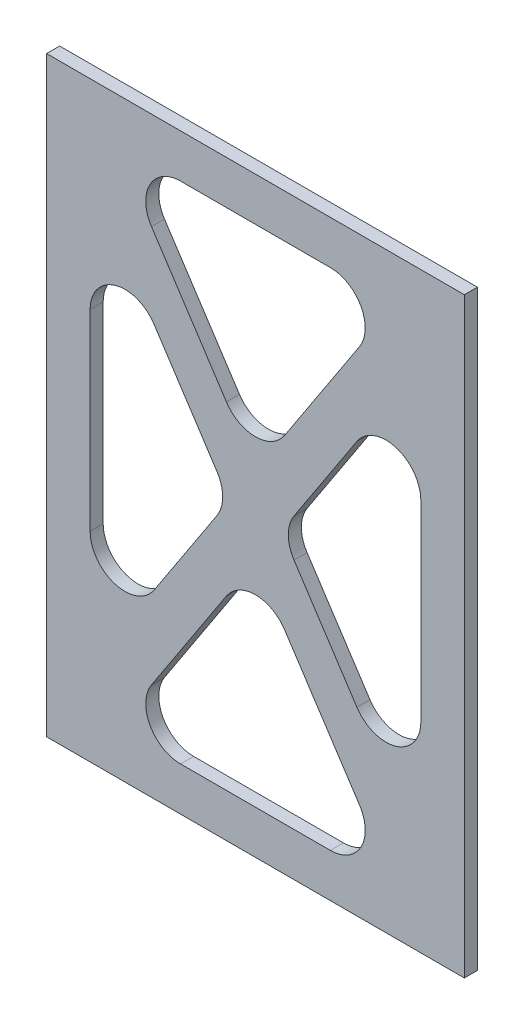
ISO-10303-21;
HEADER;
FILE_DESCRIPTION(('STEP AP214'),'2;1');
FILE_NAME('part.step','',(''),(''),'','','');
FILE_SCHEMA(('AUTOMOTIVE_DESIGN { 1 0 10303 214 1 1 1 1 }'));
ENDSEC;
DATA;
#1=APPLICATION_CONTEXT('core data for automotive mechanical design processes');
#2=APPLICATION_PROTOCOL_DEFINITION('international standard','automotive_design',2000,#1);
#3=PRODUCT_CONTEXT('',#1,'mechanical');
#4=PRODUCT('Part','Part','',(#3));
#5=PRODUCT_RELATED_PRODUCT_CATEGORY('part','',(#4));
#6=PRODUCT_DEFINITION_FORMATION('','',#4);
#7=PRODUCT_DEFINITION_CONTEXT('part definition',#1,'design');
#8=PRODUCT_DEFINITION('design','',#6,#7);
#9=PRODUCT_DEFINITION_SHAPE('','',#8);
#10=(LENGTH_UNIT() NAMED_UNIT(*) SI_UNIT(.MILLI.,.METRE.));
#11=(NAMED_UNIT(*) PLANE_ANGLE_UNIT() SI_UNIT($,.RADIAN.));
#12=(NAMED_UNIT(*) SI_UNIT($,.STERADIAN.) SOLID_ANGLE_UNIT());
#13=UNCERTAINTY_MEASURE_WITH_UNIT(LENGTH_MEASURE(1.E-05),#10,'distance_accuracy_value','');
#14=(GEOMETRIC_REPRESENTATION_CONTEXT(3) GLOBAL_UNCERTAINTY_ASSIGNED_CONTEXT((#13)) GLOBAL_UNIT_ASSIGNED_CONTEXT((#10,
#11,#12)) REPRESENTATION_CONTEXT('',''));
#15=CARTESIAN_POINT('',(0.,0.,0.));
#16=DIRECTION('',(0.,0.,1.));
#17=DIRECTION('',(1.,0.,0.));
#18=AXIS2_PLACEMENT_3D('',#15,#16,#17);
#19=CARTESIAN_POINT('',(0.,0.,3.));
#20=DIRECTION('',(0.,0.,-1.));
#21=DIRECTION('',(-1.,0.,0.));
#22=AXIS2_PLACEMENT_3D('',#19,#20,#21);
#23=PLANE('',#22);
#24=DIRECTION('',(-0.548026257310873,-0.836461129579753,0.));
#25=VECTOR('',#24,1.);
#26=CARTESIAN_POINT('',(4.18230564789876,-2.74013128655436,3.));
#27=LINE('',#26,#25);
#28=CARTESIAN_POINT('',(23.3083109633619,26.4521926159947,3.));
#29=VERTEX_POINT('',#28);
#30=CARTESIAN_POINT('',(8.84997756361549,4.38421005848697,3.));
#31=VERTEX_POINT('',#30);
#32=EDGE_CURVE('E616',#29,#31,#27,.T.);
#33=ORIENTED_EDGE('',*,*,#32,.F.);
#34=CARTESIAN_POINT('',(30.,22.0679825575077,3.));
#35=DIRECTION('',(0.,0.,-1.));
#36=DIRECTION('',(-1.,0.,0.));
#37=AXIS2_PLACEMENT_3D('',#34,#35,#36);
#38=CIRCLE('',#37,8.);
#39=CARTESIAN_POINT('',(38.,22.0679825575077,3.));
#40=VERTEX_POINT('',#39);
#41=EDGE_CURVE('E457',#29,#40,#38,.T.);
#42=ORIENTED_EDGE('',*,*,#41,.T.);
#43=DIRECTION('',(0.,1.,0.));
#44=VECTOR('',#43,1.);
#45=CARTESIAN_POINT('',(38.,0.,3.));
#46=LINE('',#45,#44);
#47=CARTESIAN_POINT('',(38.,-22.0679825575078,3.));
#48=VERTEX_POINT('',#47);
#49=EDGE_CURVE('E613',#48,#40,#46,.T.);
#50=ORIENTED_EDGE('',*,*,#49,.F.);
#51=CARTESIAN_POINT('',(30.,-22.0679825575078,3.));
#52=DIRECTION('',(0.,0.,-1.));
#53=DIRECTION('',(-1.,0.,0.));
#54=AXIS2_PLACEMENT_3D('',#51,#52,#53);
#55=CIRCLE('',#54,8.);
#56=CARTESIAN_POINT('',(23.308310963362,-26.4521926159947,3.));
#57=VERTEX_POINT('',#56);
#58=EDGE_CURVE('E421',#48,#57,#55,.T.);
#59=ORIENTED_EDGE('',*,*,#58,.T.);
#60=DIRECTION('',(0.548026257310873,-0.836461129579753,0.));
#61=VECTOR('',#60,1.);
#62=CARTESIAN_POINT('',(4.18230564789875,2.74013128655435,3.));
#63=LINE('',#62,#61);
#64=CARTESIAN_POINT('',(8.8499775636155,-4.38421005848699,3.));
#65=VERTEX_POINT('',#64);
#66=EDGE_CURVE('E619',#65,#57,#63,.T.);
#67=ORIENTED_EDGE('',*,*,#66,.F.);
#68=CARTESIAN_POINT('',(15.5416666002535,0.,3.));
#69=DIRECTION('',(0.,0.,-1.));
#70=DIRECTION('',(-1.,0.,0.));
#71=AXIS2_PLACEMENT_3D('',#68,#69,#70);
#72=CIRCLE('',#71,8.);
#73=EDGE_CURVE('E445',#65,#31,#72,.T.);
#74=ORIENTED_EDGE('',*,*,#73,.T.);
#75=EDGE_LOOP('',(#33,#42,#50,#59,#67,#74));
#76=FACE_BOUND('',#75,.T.);
#77=DIRECTION('',(0.548026257310873,-0.836461129579753,0.));
#78=VECTOR('',#77,1.);
#79=CARTESIAN_POINT('',(4.18230564789875,2.74013128655435,3.));
#80=LINE('',#79,#78);
#81=CARTESIAN_POINT('',(-23.9086431260397,45.615789941513,3.));
#82=VERTEX_POINT('',#81);
#83=CARTESIAN_POINT('',(-6.69168903663804,19.3372810682158,3.));
#84=VERTEX_POINT('',#83);
#85=EDGE_CURVE('E556',#82,#84,#80,.T.);
#86=ORIENTED_EDGE('',*,*,#85,.F.);
#87=CARTESIAN_POINT('',(-17.2169540894017,50.,3.));
#88=DIRECTION('',(0.,0.,-1.));
#89=DIRECTION('',(-1.,0.,0.));
#90=AXIS2_PLACEMENT_3D('',#87,#88,#89);
#91=CIRCLE('',#90,8.);
#92=CARTESIAN_POINT('',(-17.2169540894017,58.,3.));
#93=VERTEX_POINT('',#92);
#94=EDGE_CURVE('E119',#82,#93,#91,.T.);
#95=ORIENTED_EDGE('',*,*,#94,.T.);
#96=DIRECTION('',(-1.,0.,0.));
#97=VECTOR('',#96,1.);
#98=CARTESIAN_POINT('',(0.,58.,3.));
#99=LINE('',#98,#97);
#100=CARTESIAN_POINT('',(17.2169540894016,58.,3.));
#101=VERTEX_POINT('',#100);
#102=EDGE_CURVE('E562',#101,#93,#99,.T.);
#103=ORIENTED_EDGE('',*,*,#102,.F.);
#104=CARTESIAN_POINT('',(17.2169540894016,50.,3.));
#105=DIRECTION('',(0.,0.,-1.));
#106=DIRECTION('',(-1.,0.,0.));
#107=AXIS2_PLACEMENT_3D('',#104,#105,#106);
#108=CIRCLE('',#107,8.);
#109=CARTESIAN_POINT('',(23.9086431260396,45.615789941513,3.));
#110=VERTEX_POINT('',#109);
#111=EDGE_CURVE('E133',#101,#110,#108,.T.);
#112=ORIENTED_EDGE('',*,*,#111,.T.);
#113=DIRECTION('',(-0.548026257310873,-0.836461129579753,0.));
#114=VECTOR('',#113,1.);
#115=CARTESIAN_POINT('',(-4.18230564789877,2.74013128655437,3.));
#116=LINE('',#115,#114);
#117=CARTESIAN_POINT('',(6.69168903663801,19.3372810682158,3.));
#118=VERTEX_POINT('',#117);
#119=EDGE_CURVE('E554',#110,#118,#116,.T.);
#120=ORIENTED_EDGE('',*,*,#119,.T.);
#121=CARTESIAN_POINT('',(0.,23.7214911267028,3.));
#122=DIRECTION('',(0.,0.,-1.));
#123=DIRECTION('',(-1.,0.,0.));
#124=AXIS2_PLACEMENT_3D('',#121,#122,#123);
#125=CIRCLE('',#124,8.);
#126=EDGE_CURVE('E453',#118,#84,#125,.T.);
#127=ORIENTED_EDGE('',*,*,#126,.T.);
#128=EDGE_LOOP('',(#86,#95,#103,#112,#120,#127));
#129=FACE_BOUND('',#128,.T.);
#130=DIRECTION('',(0.,-1.,0.));
#131=VECTOR('',#130,1.);
#132=CARTESIAN_POINT('',(-38.,0.,3.));
#133=LINE('',#132,#131);
#134=CARTESIAN_POINT('',(-38.,22.0679825575078,3.));
#135=VERTEX_POINT('',#134);
#136=CARTESIAN_POINT('',(-38.,-22.0679825575078,3.));
#137=VERTEX_POINT('',#136);
#138=EDGE_CURVE('E559',#135,#137,#133,.T.);
#139=ORIENTED_EDGE('',*,*,#138,.F.);
#140=CARTESIAN_POINT('',(-30.,22.0679825575078,3.));
#141=DIRECTION('',(0.,0.,-1.));
#142=DIRECTION('',(-1.,0.,0.));
#143=AXIS2_PLACEMENT_3D('',#140,#141,#142);
#144=CIRCLE('',#143,8.);
#145=CARTESIAN_POINT('',(-23.308310963362,26.4521926159947,3.));
#146=VERTEX_POINT('',#145);
#147=EDGE_CURVE('E441',#135,#146,#144,.T.);
#148=ORIENTED_EDGE('',*,*,#147,.T.);
#149=DIRECTION('',(0.548026257310873,-0.836461129579753,0.));
#150=VECTOR('',#149,1.);
#151=CARTESIAN_POINT('',(-4.18230564789878,-2.74013128655437,3.));
#152=LINE('',#151,#150);
#153=CARTESIAN_POINT('',(-8.84997756361553,4.38421005848697,3.));
#154=VERTEX_POINT('',#153);
#155=EDGE_CURVE('E555',#146,#154,#152,.T.);
#156=ORIENTED_EDGE('',*,*,#155,.T.);
#157=CARTESIAN_POINT('',(-15.5416666002536,0.,3.));
#158=DIRECTION('',(0.,0.,-1.));
#159=DIRECTION('',(-1.,0.,0.));
#160=AXIS2_PLACEMENT_3D('',#157,#158,#159);
#161=CIRCLE('',#160,8.);
#162=CARTESIAN_POINT('',(-8.84997756361553,-4.38421005848699,3.));
#163=VERTEX_POINT('',#162);
#164=EDGE_CURVE('E449',#154,#163,#161,.T.);
#165=ORIENTED_EDGE('',*,*,#164,.T.);
#166=DIRECTION('',(-0.548026257310873,-0.836461129579753,0.));
#167=VECTOR('',#166,1.);
#168=CARTESIAN_POINT('',(-4.18230564789877,2.74013128655437,3.));
#169=LINE('',#168,#167);
#170=CARTESIAN_POINT('',(-23.308310963362,-26.4521926159948,3.));
#171=VERTEX_POINT('',#170);
#172=EDGE_CURVE('E568',#163,#171,#169,.T.);
#173=ORIENTED_EDGE('',*,*,#172,.T.);
#174=CARTESIAN_POINT('',(-30.,-22.0679825575078,3.));
#175=DIRECTION('',(0.,0.,-1.));
#176=DIRECTION('',(-1.,0.,0.));
#177=AXIS2_PLACEMENT_3D('',#174,#175,#176);
#178=CIRCLE('',#177,8.);
#179=EDGE_CURVE('E437',#171,#137,#178,.T.);
#180=ORIENTED_EDGE('',*,*,#179,.T.);
#181=EDGE_LOOP('',(#139,#148,#156,#165,#173,#180));
#182=FACE_BOUND('',#181,.T.);
#183=DIRECTION('',(0.,1.,0.));
#184=VECTOR('',#183,1.);
#185=CARTESIAN_POINT('',(48.,-68.,3.));
#186=LINE('',#185,#184);
#187=CARTESIAN_POINT('',(48.,-68.,3.));
#188=VERTEX_POINT('',#187);
#189=CARTESIAN_POINT('',(48.,68.,3.));
#190=VERTEX_POINT('',#189);
#191=EDGE_CURVE('E307',#188,#190,#186,.T.);
#192=ORIENTED_EDGE('',*,*,#191,.T.);
#193=DIRECTION('',(-1.,0.,0.));
#194=VECTOR('',#193,1.);
#195=CARTESIAN_POINT('',(-48.,68.,3.));
#196=LINE('',#195,#194);
#197=CARTESIAN_POINT('',(-48.,68.,3.));
#198=VERTEX_POINT('',#197);
#199=EDGE_CURVE('E296',#190,#198,#196,.T.);
#200=ORIENTED_EDGE('',*,*,#199,.T.);
#201=DIRECTION('',(0.,-1.,0.));
#202=VECTOR('',#201,1.);
#203=CARTESIAN_POINT('',(-48.,-68.,3.));
#204=LINE('',#203,#202);
#205=CARTESIAN_POINT('',(-48.,-68.,3.));
#206=VERTEX_POINT('',#205);
#207=EDGE_CURVE('E306',#198,#206,#204,.T.);
#208=ORIENTED_EDGE('',*,*,#207,.T.);
#209=DIRECTION('',(1.,0.,0.));
#210=VECTOR('',#209,1.);
#211=CARTESIAN_POINT('',(-48.,-68.,3.));
#212=LINE('',#211,#210);
#213=EDGE_CURVE('E312',#206,#188,#212,.T.);
#214=ORIENTED_EDGE('',*,*,#213,.T.);
#215=EDGE_LOOP('',(#192,#200,#208,#214));
#216=FACE_BOUND('',#215,.T.);
#217=DIRECTION('',(-0.548026257310873,-0.836461129579753,0.));
#218=VECTOR('',#217,1.);
#219=CARTESIAN_POINT('',(4.18230564789876,-2.74013128655436,3.));
#220=LINE('',#219,#218);
#221=CARTESIAN_POINT('',(-6.69168903663804,-19.3372810682158,3.));
#222=VERTEX_POINT('',#221);
#223=CARTESIAN_POINT('',(-23.9086431260397,-45.615789941513,3.));
#224=VERTEX_POINT('',#223);
#225=EDGE_CURVE('E606',#222,#224,#220,.T.);
#226=ORIENTED_EDGE('',*,*,#225,.F.);
#227=CARTESIAN_POINT('',(0.,-23.7214911267028,3.));
#228=DIRECTION('',(0.,0.,-1.));
#229=DIRECTION('',(-1.,0.,0.));
#230=AXIS2_PLACEMENT_3D('',#227,#228,#229);
#231=CIRCLE('',#230,8.);
#232=CARTESIAN_POINT('',(6.69168903663801,-19.3372810682158,3.));
#233=VERTEX_POINT('',#232);
#234=EDGE_CURVE('E429',#222,#233,#231,.T.);
#235=ORIENTED_EDGE('',*,*,#234,.T.);
#236=DIRECTION('',(0.548026257310873,-0.836461129579753,0.));
#237=VECTOR('',#236,1.);
#238=CARTESIAN_POINT('',(-4.18230564789878,-2.74013128655437,3.));
#239=LINE('',#238,#237);
#240=CARTESIAN_POINT('',(23.9086431260397,-45.615789941513,3.));
#241=VERTEX_POINT('',#240);
#242=EDGE_CURVE('E601',#233,#241,#239,.T.);
#243=ORIENTED_EDGE('',*,*,#242,.T.);
#244=CARTESIAN_POINT('',(17.2169540894016,-50.,3.));
#245=DIRECTION('',(0.,0.,-1.));
#246=DIRECTION('',(-1.,0.,0.));
#247=AXIS2_PLACEMENT_3D('',#244,#245,#246);
#248=CIRCLE('',#247,8.);
#249=CARTESIAN_POINT('',(17.2169540894016,-58.,3.));
#250=VERTEX_POINT('',#249);
#251=EDGE_CURVE('E425',#241,#250,#248,.T.);
#252=ORIENTED_EDGE('',*,*,#251,.T.);
#253=DIRECTION('',(1.,0.,0.));
#254=VECTOR('',#253,1.);
#255=CARTESIAN_POINT('',(0.,-58.,3.));
#256=LINE('',#255,#254);
#257=CARTESIAN_POINT('',(-17.2169540894017,-58.,3.));
#258=VERTEX_POINT('',#257);
#259=EDGE_CURVE('E609',#258,#250,#256,.T.);
#260=ORIENTED_EDGE('',*,*,#259,.F.);
#261=CARTESIAN_POINT('',(-17.2169540894017,-50.,3.));
#262=DIRECTION('',(0.,0.,-1.));
#263=DIRECTION('',(-1.,0.,0.));
#264=AXIS2_PLACEMENT_3D('',#261,#262,#263);
#265=CIRCLE('',#264,8.);
#266=EDGE_CURVE('E433',#258,#224,#265,.T.);
#267=ORIENTED_EDGE('',*,*,#266,.T.);
#268=EDGE_LOOP('',(#226,#235,#243,#252,#260,#267));
#269=FACE_BOUND('',#268,.T.);
#270=ADVANCED_FACE('F111',(#76,#129,#182,#216,#269),#23,.F.);
#271=CARTESIAN_POINT('',(0.,0.,0.));
#272=DIRECTION('',(0.,0.,-1.));
#273=DIRECTION('',(-1.,0.,0.));
#274=AXIS2_PLACEMENT_3D('',#271,#272,#273);
#275=PLANE('',#274);
#276=DIRECTION('',(0.,-1.,0.));
#277=VECTOR('',#276,1.);
#278=CARTESIAN_POINT('',(38.,0.,0.));
#279=LINE('',#278,#277);
#280=CARTESIAN_POINT('',(38.,22.0679825575077,0.));
#281=VERTEX_POINT('',#280);
#282=CARTESIAN_POINT('',(38.,-22.0679825575078,0.));
#283=VERTEX_POINT('',#282);
#284=EDGE_CURVE('E359',#281,#283,#279,.T.);
#285=ORIENTED_EDGE('',*,*,#284,.F.);
#286=CARTESIAN_POINT('',(30.,22.0679825575077,0.));
#287=DIRECTION('',(0.,0.,-1.));
#288=DIRECTION('',(-1.,0.,0.));
#289=AXIS2_PLACEMENT_3D('',#286,#287,#288);
#290=CIRCLE('',#289,8.);
#291=CARTESIAN_POINT('',(23.308310963362,26.4521926159947,0.));
#292=VERTEX_POINT('',#291);
#293=EDGE_CURVE('E459',#281,#292,#290,.F.);
#294=ORIENTED_EDGE('',*,*,#293,.T.);
#295=DIRECTION('',(0.548026257310873,0.836461129579753,0.));
#296=VECTOR('',#295,1.);
#297=CARTESIAN_POINT('',(4.18230564789876,-2.74013128655436,0.));
#298=LINE('',#297,#296);
#299=CARTESIAN_POINT('',(8.84997756361549,4.38421005848697,0.));
#300=VERTEX_POINT('',#299);
#301=EDGE_CURVE('E353',#300,#292,#298,.T.);
#302=ORIENTED_EDGE('',*,*,#301,.F.);
#303=CARTESIAN_POINT('',(15.5416666002535,0.,0.));
#304=DIRECTION('',(0.,0.,-1.));
#305=DIRECTION('',(-1.,0.,0.));
#306=AXIS2_PLACEMENT_3D('',#303,#304,#305);
#307=CIRCLE('',#306,8.);
#308=CARTESIAN_POINT('',(8.8499775636155,-4.384210058487,0.));
#309=VERTEX_POINT('',#308);
#310=EDGE_CURVE('E447',#300,#309,#307,.F.);
#311=ORIENTED_EDGE('',*,*,#310,.T.);
#312=DIRECTION('',(-0.548026257310873,0.836461129579753,0.));
#313=VECTOR('',#312,1.);
#314=CARTESIAN_POINT('',(4.18230564789875,2.74013128655435,0.));
#315=LINE('',#314,#313);
#316=CARTESIAN_POINT('',(23.308310963362,-26.4521926159948,0.));
#317=VERTEX_POINT('',#316);
#318=EDGE_CURVE('E356',#317,#309,#315,.T.);
#319=ORIENTED_EDGE('',*,*,#318,.F.);
#320=CARTESIAN_POINT('',(30.,-22.0679825575078,0.));
#321=DIRECTION('',(0.,0.,-1.));
#322=DIRECTION('',(-1.,0.,0.));
#323=AXIS2_PLACEMENT_3D('',#320,#321,#322);
#324=CIRCLE('',#323,8.);
#325=EDGE_CURVE('E423',#317,#283,#324,.F.);
#326=ORIENTED_EDGE('',*,*,#325,.T.);
#327=EDGE_LOOP('',(#285,#294,#302,#311,#319,#326));
#328=FACE_BOUND('',#327,.T.);
#329=DIRECTION('',(1.,0.,0.));
#330=VECTOR('',#329,1.);
#331=CARTESIAN_POINT('',(0.,58.,0.));
#332=LINE('',#331,#330);
#333=CARTESIAN_POINT('',(-17.2169540894017,58.,0.));
#334=VERTEX_POINT('',#333);
#335=CARTESIAN_POINT('',(17.2169540894016,58.,0.));
#336=VERTEX_POINT('',#335);
#337=EDGE_CURVE('E350',#334,#336,#332,.T.);
#338=ORIENTED_EDGE('',*,*,#337,.F.);
#339=CARTESIAN_POINT('',(-17.2169540894017,50.,0.));
#340=DIRECTION('',(0.,0.,-1.));
#341=DIRECTION('',(-1.,0.,0.));
#342=AXIS2_PLACEMENT_3D('',#339,#340,#341);
#343=CIRCLE('',#342,8.);
#344=CARTESIAN_POINT('',(-23.9086431260397,45.615789941513,0.));
#345=VERTEX_POINT('',#344);
#346=EDGE_CURVE('E12',#334,#345,#343,.F.);
#347=ORIENTED_EDGE('',*,*,#346,.T.);
#348=DIRECTION('',(-0.548026257310873,0.836461129579753,0.));
#349=VECTOR('',#348,1.);
#350=CARTESIAN_POINT('',(4.18230564789875,2.74013128655435,0.));
#351=LINE('',#350,#349);
#352=CARTESIAN_POINT('',(-6.69168903663805,19.3372810682158,0.));
#353=VERTEX_POINT('',#352);
#354=EDGE_CURVE('E344',#353,#345,#351,.T.);
#355=ORIENTED_EDGE('',*,*,#354,.F.);
#356=CARTESIAN_POINT('',(0.,23.7214911267028,0.));
#357=DIRECTION('',(0.,0.,-1.));
#358=DIRECTION('',(-1.,0.,0.));
#359=AXIS2_PLACEMENT_3D('',#356,#357,#358);
#360=CIRCLE('',#359,8.);
#361=CARTESIAN_POINT('',(6.69168903663801,19.3372810682158,0.));
#362=VERTEX_POINT('',#361);
#363=EDGE_CURVE('E455',#353,#362,#360,.F.);
#364=ORIENTED_EDGE('',*,*,#363,.T.);
#365=DIRECTION('',(0.548026257310873,0.836461129579753,0.));
#366=VECTOR('',#365,1.);
#367=CARTESIAN_POINT('',(-4.18230564789877,2.74013128655437,0.));
#368=LINE('',#367,#366);
#369=CARTESIAN_POINT('',(23.9086431260396,45.615789941513,0.));
#370=VERTEX_POINT('',#369);
#371=EDGE_CURVE('E347',#362,#370,#368,.T.);
#372=ORIENTED_EDGE('',*,*,#371,.T.);
#373=CARTESIAN_POINT('',(17.2169540894016,50.,0.));
#374=DIRECTION('',(0.,0.,-1.));
#375=DIRECTION('',(-1.,0.,0.));
#376=AXIS2_PLACEMENT_3D('',#373,#374,#375);
#377=CIRCLE('',#376,8.);
#378=EDGE_CURVE('E462',#370,#336,#377,.F.);
#379=ORIENTED_EDGE('',*,*,#378,.T.);
#380=EDGE_LOOP('',(#338,#347,#355,#364,#372,#379));
#381=FACE_BOUND('',#380,.T.);
#382=DIRECTION('',(0.,1.,0.));
#383=VECTOR('',#382,1.);
#384=CARTESIAN_POINT('',(48.,-68.,0.));
#385=LINE('',#384,#383);
#386=CARTESIAN_POINT('',(48.,-68.,0.));
#387=VERTEX_POINT('',#386);
#388=CARTESIAN_POINT('',(48.,68.,0.));
#389=VERTEX_POINT('',#388);
#390=EDGE_CURVE('E320',#387,#389,#385,.T.);
#391=ORIENTED_EDGE('',*,*,#390,.F.);
#392=DIRECTION('',(1.,0.,0.));
#393=VECTOR('',#392,1.);
#394=CARTESIAN_POINT('',(-48.,-68.,0.));
#395=LINE('',#394,#393);
#396=CARTESIAN_POINT('',(-48.,-68.,0.));
#397=VERTEX_POINT('',#396);
#398=EDGE_CURVE('E316',#397,#387,#395,.T.);
#399=ORIENTED_EDGE('',*,*,#398,.F.);
#400=DIRECTION('',(0.,-1.,0.));
#401=VECTOR('',#400,1.);
#402=CARTESIAN_POINT('',(-48.,-68.,0.));
#403=LINE('',#402,#401);
#404=CARTESIAN_POINT('',(-48.,68.,0.));
#405=VERTEX_POINT('',#404);
#406=EDGE_CURVE('E577',#405,#397,#403,.T.);
#407=ORIENTED_EDGE('',*,*,#406,.F.);
#408=DIRECTION('',(-1.,0.,0.));
#409=VECTOR('',#408,1.);
#410=CARTESIAN_POINT('',(-48.,68.,0.));
#411=LINE('',#410,#409);
#412=EDGE_CURVE('E575',#389,#405,#411,.T.);
#413=ORIENTED_EDGE('',*,*,#412,.F.);
#414=EDGE_LOOP('',(#391,#399,#407,#413));
#415=FACE_BOUND('',#414,.T.);
#416=DIRECTION('',(0.,1.,0.));
#417=VECTOR('',#416,1.);
#418=CARTESIAN_POINT('',(-38.,0.,0.));
#419=LINE('',#418,#417);
#420=CARTESIAN_POINT('',(-38.,-22.0679825575078,0.));
#421=VERTEX_POINT('',#420);
#422=CARTESIAN_POINT('',(-38.,22.0679825575078,0.));
#423=VERTEX_POINT('',#422);
#424=EDGE_CURVE('E321',#421,#423,#419,.T.);
#425=ORIENTED_EDGE('',*,*,#424,.F.);
#426=CARTESIAN_POINT('',(-30.,-22.0679825575078,0.));
#427=DIRECTION('',(0.,0.,-1.));
#428=DIRECTION('',(-1.,0.,0.));
#429=AXIS2_PLACEMENT_3D('',#426,#427,#428);
#430=CIRCLE('',#429,8.);
#431=CARTESIAN_POINT('',(-23.308310963362,-26.4521926159948,0.));
#432=VERTEX_POINT('',#431);
#433=EDGE_CURVE('E439',#421,#432,#430,.F.);
#434=ORIENTED_EDGE('',*,*,#433,.T.);
#435=DIRECTION('',(0.548026257310873,0.836461129579753,0.));
#436=VECTOR('',#435,1.);
#437=CARTESIAN_POINT('',(-4.18230564789877,2.74013128655437,0.));
#438=LINE('',#437,#436);
#439=CARTESIAN_POINT('',(-8.84997756361553,-4.38421005848699,0.));
#440=VERTEX_POINT('',#439);
#441=EDGE_CURVE('E324',#432,#440,#438,.T.);
#442=ORIENTED_EDGE('',*,*,#441,.T.);
#443=CARTESIAN_POINT('',(-15.5416666002536,0.,0.));
#444=DIRECTION('',(0.,0.,-1.));
#445=DIRECTION('',(-1.,0.,0.));
#446=AXIS2_PLACEMENT_3D('',#443,#444,#445);
#447=CIRCLE('',#446,8.);
#448=CARTESIAN_POINT('',(-8.84997756361553,4.38421005848698,0.));
#449=VERTEX_POINT('',#448);
#450=EDGE_CURVE('E451',#440,#449,#447,.F.);
#451=ORIENTED_EDGE('',*,*,#450,.T.);
#452=DIRECTION('',(-0.548026257310873,0.836461129579753,0.));
#453=VECTOR('',#452,1.);
#454=CARTESIAN_POINT('',(-4.18230564789878,-2.74013128655438,0.));
#455=LINE('',#454,#453);
#456=CARTESIAN_POINT('',(-23.308310963362,26.4521926159947,0.));
#457=VERTEX_POINT('',#456);
#458=EDGE_CURVE('E332',#449,#457,#455,.T.);
#459=ORIENTED_EDGE('',*,*,#458,.T.);
#460=CARTESIAN_POINT('',(-30.,22.0679825575078,0.));
#461=DIRECTION('',(0.,0.,-1.));
#462=DIRECTION('',(-1.,0.,0.));
#463=AXIS2_PLACEMENT_3D('',#460,#461,#462);
#464=CIRCLE('',#463,8.);
#465=EDGE_CURVE('E443',#457,#423,#464,.F.);
#466=ORIENTED_EDGE('',*,*,#465,.T.);
#467=EDGE_LOOP('',(#425,#434,#442,#451,#459,#466));
#468=FACE_BOUND('',#467,.T.);
#469=DIRECTION('',(-1.,0.,0.));
#470=VECTOR('',#469,1.);
#471=CARTESIAN_POINT('',(0.,-58.,0.));
#472=LINE('',#471,#470);
#473=CARTESIAN_POINT('',(17.2169540894016,-58.,0.));
#474=VERTEX_POINT('',#473);
#475=CARTESIAN_POINT('',(-17.2169540894017,-58.,0.));
#476=VERTEX_POINT('',#475);
#477=EDGE_CURVE('E338',#474,#476,#472,.T.);
#478=ORIENTED_EDGE('',*,*,#477,.F.);
#479=CARTESIAN_POINT('',(17.2169540894016,-50.,0.));
#480=DIRECTION('',(0.,0.,-1.));
#481=DIRECTION('',(-1.,0.,0.));
#482=AXIS2_PLACEMENT_3D('',#479,#480,#481);
#483=CIRCLE('',#482,8.);
#484=CARTESIAN_POINT('',(23.9086431260397,-45.6157899415131,0.));
#485=VERTEX_POINT('',#484);
#486=EDGE_CURVE('E427',#474,#485,#483,.F.);
#487=ORIENTED_EDGE('',*,*,#486,.T.);
#488=DIRECTION('',(-0.548026257310873,0.836461129579753,0.));
#489=VECTOR('',#488,1.);
#490=CARTESIAN_POINT('',(-4.18230564789878,-2.74013128655438,0.));
#491=LINE('',#490,#489);
#492=CARTESIAN_POINT('',(6.69168903663802,-19.3372810682158,0.));
#493=VERTEX_POINT('',#492);
#494=EDGE_CURVE('E341',#485,#493,#491,.T.);
#495=ORIENTED_EDGE('',*,*,#494,.T.);
#496=CARTESIAN_POINT('',(0.,-23.7214911267028,0.));
#497=DIRECTION('',(0.,0.,-1.));
#498=DIRECTION('',(-1.,0.,0.));
#499=AXIS2_PLACEMENT_3D('',#496,#497,#498);
#500=CIRCLE('',#499,8.);
#501=CARTESIAN_POINT('',(-6.69168903663804,-19.3372810682158,0.));
#502=VERTEX_POINT('',#501);
#503=EDGE_CURVE('E431',#493,#502,#500,.F.);
#504=ORIENTED_EDGE('',*,*,#503,.T.);
#505=DIRECTION('',(0.548026257310873,0.836461129579753,0.));
#506=VECTOR('',#505,1.);
#507=CARTESIAN_POINT('',(4.18230564789876,-2.74013128655436,0.));
#508=LINE('',#507,#506);
#509=CARTESIAN_POINT('',(-23.9086431260397,-45.615789941513,0.));
#510=VERTEX_POINT('',#509);
#511=EDGE_CURVE('E335',#510,#502,#508,.T.);
#512=ORIENTED_EDGE('',*,*,#511,.F.);
#513=CARTESIAN_POINT('',(-17.2169540894017,-50.,0.));
#514=DIRECTION('',(0.,0.,-1.));
#515=DIRECTION('',(-1.,0.,0.));
#516=AXIS2_PLACEMENT_3D('',#513,#514,#515);
#517=CIRCLE('',#516,8.);
#518=EDGE_CURVE('E435',#510,#476,#517,.F.);
#519=ORIENTED_EDGE('',*,*,#518,.T.);
#520=EDGE_LOOP('',(#478,#487,#495,#504,#512,#519));
#521=FACE_BOUND('',#520,.T.);
#522=ADVANCED_FACE('F466',(#328,#381,#415,#468,#521),#275,.T.);
#523=CARTESIAN_POINT('',(48.,-68.,3.));
#524=DIRECTION('',(-1.,0.,0.));
#525=DIRECTION('',(0.,0.,1.));
#526=AXIS2_PLACEMENT_3D('',#523,#524,#525);
#527=PLANE('',#526);
#528=ORIENTED_EDGE('',*,*,#390,.T.);
#529=DIRECTION('',(0.,0.,-1.));
#530=VECTOR('',#529,1.);
#531=CARTESIAN_POINT('',(48.,68.,3.));
#532=LINE('',#531,#530);
#533=EDGE_CURVE('E300',#190,#389,#532,.T.);
#534=ORIENTED_EDGE('',*,*,#533,.F.);
#535=ORIENTED_EDGE('',*,*,#191,.F.);
#536=DIRECTION('',(0.,0.,-1.));
#537=VECTOR('',#536,1.);
#538=CARTESIAN_POINT('',(48.,-68.,3.));
#539=LINE('',#538,#537);
#540=EDGE_CURVE('E573',#188,#387,#539,.T.);
#541=ORIENTED_EDGE('',*,*,#540,.T.);
#542=EDGE_LOOP('',(#528,#534,#535,#541));
#543=FACE_BOUND('',#542,.T.);
#544=ADVANCED_FACE('F318',(#543),#527,.F.);
#545=CARTESIAN_POINT('',(-48.,68.,3.));
#546=DIRECTION('',(0.,-1.,0.));
#547=DIRECTION('',(0.,0.,-1.));
#548=AXIS2_PLACEMENT_3D('',#545,#546,#547);
#549=PLANE('',#548);
#550=ORIENTED_EDGE('',*,*,#412,.T.);
#551=DIRECTION('',(0.,0.,-1.));
#552=VECTOR('',#551,1.);
#553=CARTESIAN_POINT('',(-48.,68.,3.));
#554=LINE('',#553,#552);
#555=EDGE_CURVE('E303',#198,#405,#554,.T.);
#556=ORIENTED_EDGE('',*,*,#555,.F.);
#557=ORIENTED_EDGE('',*,*,#199,.F.);
#558=ORIENTED_EDGE('',*,*,#533,.T.);
#559=EDGE_LOOP('',(#550,#556,#557,#558));
#560=FACE_BOUND('',#559,.T.);
#561=ADVANCED_FACE('F298',(#560),#549,.F.);
#562=CARTESIAN_POINT('',(-48.,-68.,3.));
#563=DIRECTION('',(1.,0.,0.));
#564=DIRECTION('',(0.,0.,-1.));
#565=AXIS2_PLACEMENT_3D('',#562,#563,#564);
#566=PLANE('',#565);
#567=ORIENTED_EDGE('',*,*,#406,.T.);
#568=DIRECTION('',(0.,0.,-1.));
#569=VECTOR('',#568,1.);
#570=CARTESIAN_POINT('',(-48.,-68.,3.));
#571=LINE('',#570,#569);
#572=EDGE_CURVE('E326',#206,#397,#571,.T.);
#573=ORIENTED_EDGE('',*,*,#572,.F.);
#574=ORIENTED_EDGE('',*,*,#207,.F.);
#575=ORIENTED_EDGE('',*,*,#555,.T.);
#576=EDGE_LOOP('',(#567,#573,#574,#575));
#577=FACE_BOUND('',#576,.T.);
#578=ADVANCED_FACE('F500',(#577),#566,.F.);
#579=CARTESIAN_POINT('',(-48.,-68.,3.));
#580=DIRECTION('',(0.,1.,0.));
#581=DIRECTION('',(0.,0.,1.));
#582=AXIS2_PLACEMENT_3D('',#579,#580,#581);
#583=PLANE('',#582);
#584=ORIENTED_EDGE('',*,*,#398,.T.);
#585=ORIENTED_EDGE('',*,*,#540,.F.);
#586=ORIENTED_EDGE('',*,*,#213,.F.);
#587=ORIENTED_EDGE('',*,*,#572,.T.);
#588=EDGE_LOOP('',(#584,#585,#586,#587));
#589=FACE_BOUND('',#588,.T.);
#590=ADVANCED_FACE('F498',(#589),#583,.F.);
#591=CARTESIAN_POINT('',(-4.18230564789878,-2.74013128655437,-7.));
#592=DIRECTION('',(-0.836461129579753,-0.548026257310873,0.));
#593=DIRECTION('',(0.548026257310873,-0.836461129579753,0.));
#594=AXIS2_PLACEMENT_3D('',#591,#592,#593);
#595=PLANE('',#594);
#596=ORIENTED_EDGE('',*,*,#155,.F.);
#597=DIRECTION('',(0.,0.,1.));
#598=VECTOR('',#597,1.);
#599=CARTESIAN_POINT('',(-23.308310963362,26.4521926159947,-7.));
#600=LINE('',#599,#598);
#601=EDGE_CURVE('E400',#146,#457,#600,.F.);
#602=ORIENTED_EDGE('',*,*,#601,.T.);
#603=ORIENTED_EDGE('',*,*,#458,.F.);
#604=DIRECTION('',(0.,0.,1.));
#605=VECTOR('',#604,1.);
#606=CARTESIAN_POINT('',(-8.84997756361553,4.38421005848697,3.));
#607=LINE('',#606,#605);
#608=EDGE_CURVE('E397',#449,#154,#607,.T.);
#609=ORIENTED_EDGE('',*,*,#608,.T.);
#610=EDGE_LOOP('',(#596,#602,#603,#609));
#611=FACE_BOUND('',#610,.T.);
#612=ADVANCED_FACE('F495',(#611),#595,.T.);
#613=CARTESIAN_POINT('',(-4.18230564789877,2.74013128655437,-7.));
#614=DIRECTION('',(-0.836461129579753,0.548026257310873,0.));
#615=DIRECTION('',(-0.548026257310873,-0.836461129579753,0.));
#616=AXIS2_PLACEMENT_3D('',#613,#614,#615);
#617=PLANE('',#616);
#618=ORIENTED_EDGE('',*,*,#441,.F.);
#619=DIRECTION('',(0.,0.,1.));
#620=VECTOR('',#619,1.);
#621=CARTESIAN_POINT('',(-23.308310963362,-26.4521926159948,-7.));
#622=LINE('',#621,#620);
#623=EDGE_CURVE('E389',#432,#171,#622,.T.);
#624=ORIENTED_EDGE('',*,*,#623,.T.);
#625=ORIENTED_EDGE('',*,*,#172,.F.);
#626=DIRECTION('',(0.,0.,1.));
#627=VECTOR('',#626,1.);
#628=CARTESIAN_POINT('',(-8.84997756361553,-4.38421005848699,0.));
#629=LINE('',#628,#627);
#630=EDGE_CURVE('E387',#163,#440,#629,.F.);
#631=ORIENTED_EDGE('',*,*,#630,.T.);
#632=EDGE_LOOP('',(#618,#624,#625,#631));
#633=FACE_BOUND('',#632,.T.);
#634=ADVANCED_FACE('F635',(#633),#617,.T.);
#635=CARTESIAN_POINT('',(-38.,0.,-7.));
#636=DIRECTION('',(-1.,0.,0.));
#637=DIRECTION('',(0.,0.,1.));
#638=AXIS2_PLACEMENT_3D('',#635,#636,#637);
#639=PLANE('',#638);
#640=ORIENTED_EDGE('',*,*,#138,.T.);
#641=DIRECTION('',(0.,0.,1.));
#642=VECTOR('',#641,1.);
#643=CARTESIAN_POINT('',(-38.,-22.0679825575078,-7.));
#644=LINE('',#643,#642);
#645=EDGE_CURVE('E395',#137,#421,#644,.F.);
#646=ORIENTED_EDGE('',*,*,#645,.T.);
#647=ORIENTED_EDGE('',*,*,#424,.T.);
#648=DIRECTION('',(0.,0.,1.));
#649=VECTOR('',#648,1.);
#650=CARTESIAN_POINT('',(-38.,22.0679825575078,-7.));
#651=LINE('',#650,#649);
#652=EDGE_CURVE('E392',#423,#135,#651,.T.);
#653=ORIENTED_EDGE('',*,*,#652,.T.);
#654=EDGE_LOOP('',(#640,#646,#647,#653));
#655=FACE_BOUND('',#654,.T.);
#656=ADVANCED_FACE('F629',(#655),#639,.F.);
#657=CARTESIAN_POINT('',(-4.18230564789878,-2.74013128655437,-7.));
#658=DIRECTION('',(-0.836461129579753,-0.548026257310873,0.));
#659=DIRECTION('',(0.548026257310873,-0.836461129579753,0.));
#660=AXIS2_PLACEMENT_3D('',#657,#658,#659);
#661=PLANE('',#660);
#662=ORIENTED_EDGE('',*,*,#494,.F.);
#663=DIRECTION('',(0.,0.,1.));
#664=VECTOR('',#663,1.);
#665=CARTESIAN_POINT('',(23.9086431260396,-45.615789941513,-7.));
#666=LINE('',#665,#664);
#667=EDGE_CURVE('E374',#485,#241,#666,.T.);
#668=ORIENTED_EDGE('',*,*,#667,.T.);
#669=ORIENTED_EDGE('',*,*,#242,.F.);
#670=DIRECTION('',(0.,0.,1.));
#671=VECTOR('',#670,1.);
#672=CARTESIAN_POINT('',(6.69168903663801,-19.3372810682158,-7.));
#673=LINE('',#672,#671);
#674=EDGE_CURVE('E372',#233,#493,#673,.F.);
#675=ORIENTED_EDGE('',*,*,#674,.T.);
#676=EDGE_LOOP('',(#662,#668,#669,#675));
#677=FACE_BOUND('',#676,.T.);
#678=ADVANCED_FACE('F600',(#677),#661,.T.);
#679=CARTESIAN_POINT('',(0.,-58.,-7.));
#680=DIRECTION('',(0.,-1.,0.));
#681=DIRECTION('',(0.,0.,-1.));
#682=AXIS2_PLACEMENT_3D('',#679,#680,#681);
#683=PLANE('',#682);
#684=ORIENTED_EDGE('',*,*,#259,.T.);
#685=DIRECTION('',(0.,0.,1.));
#686=VECTOR('',#685,1.);
#687=CARTESIAN_POINT('',(17.2169540894016,-58.,-7.));
#688=LINE('',#687,#686);
#689=EDGE_CURVE('E380',#250,#474,#688,.F.);
#690=ORIENTED_EDGE('',*,*,#689,.T.);
#691=ORIENTED_EDGE('',*,*,#477,.T.);
#692=DIRECTION('',(0.,0.,1.));
#693=VECTOR('',#692,1.);
#694=CARTESIAN_POINT('',(-17.2169540894017,-58.,3.));
#695=LINE('',#694,#693);
#696=EDGE_CURVE('E377',#476,#258,#695,.T.);
#697=ORIENTED_EDGE('',*,*,#696,.T.);
#698=EDGE_LOOP('',(#684,#690,#691,#697));
#699=FACE_BOUND('',#698,.T.);
#700=ADVANCED_FACE('F672',(#699),#683,.F.);
#701=CARTESIAN_POINT('',(4.18230564789876,-2.74013128655436,-7.));
#702=DIRECTION('',(-0.836461129579753,0.548026257310873,0.));
#703=DIRECTION('',(-0.548026257310873,-0.836461129579753,0.));
#704=AXIS2_PLACEMENT_3D('',#701,#702,#703);
#705=PLANE('',#704);
#706=ORIENTED_EDGE('',*,*,#511,.T.);
#707=DIRECTION('',(0.,0.,1.));
#708=VECTOR('',#707,1.);
#709=CARTESIAN_POINT('',(-6.69168903663804,-19.3372810682158,-7.));
#710=LINE('',#709,#708);
#711=EDGE_CURVE('E384',#502,#222,#710,.T.);
#712=ORIENTED_EDGE('',*,*,#711,.T.);
#713=ORIENTED_EDGE('',*,*,#225,.T.);
#714=DIRECTION('',(0.,0.,1.));
#715=VECTOR('',#714,1.);
#716=CARTESIAN_POINT('',(-23.9086431260397,-45.615789941513,0.));
#717=LINE('',#716,#715);
#718=EDGE_CURVE('E382',#224,#510,#717,.F.);
#719=ORIENTED_EDGE('',*,*,#718,.T.);
#720=EDGE_LOOP('',(#706,#712,#713,#719));
#721=FACE_BOUND('',#720,.T.);
#722=ADVANCED_FACE('F654',(#721),#705,.F.);
#723=CARTESIAN_POINT('',(0.,58.,-7.));
#724=DIRECTION('',(0.,1.,0.));
#725=DIRECTION('',(0.,0.,1.));
#726=AXIS2_PLACEMENT_3D('',#723,#724,#725);
#727=PLANE('',#726);
#728=ORIENTED_EDGE('',*,*,#337,.T.);
#729=DIRECTION('',(0.,0.,1.));
#730=VECTOR('',#729,1.);
#731=CARTESIAN_POINT('',(17.2169540894016,58.,-7.));
#732=LINE('',#731,#730);
#733=EDGE_CURVE('E419',#336,#101,#732,.T.);
#734=ORIENTED_EDGE('',*,*,#733,.T.);
#735=ORIENTED_EDGE('',*,*,#102,.T.);
#736=DIRECTION('',(0.,0.,1.));
#737=VECTOR('',#736,1.);
#738=CARTESIAN_POINT('',(-17.2169540894017,58.,0.));
#739=LINE('',#738,#737);
#740=EDGE_CURVE('E417',#93,#334,#739,.F.);
#741=ORIENTED_EDGE('',*,*,#740,.T.);
#742=EDGE_LOOP('',(#728,#734,#735,#741));
#743=FACE_BOUND('',#742,.T.);
#744=ADVANCED_FACE('F471',(#743),#727,.F.);
#745=CARTESIAN_POINT('',(-4.18230564789877,2.74013128655437,-7.));
#746=DIRECTION('',(-0.836461129579753,0.548026257310873,0.));
#747=DIRECTION('',(-0.548026257310873,-0.836461129579753,0.));
#748=AXIS2_PLACEMENT_3D('',#745,#746,#747);
#749=PLANE('',#748);
#750=ORIENTED_EDGE('',*,*,#371,.F.);
#751=DIRECTION('',(0.,0.,1.));
#752=VECTOR('',#751,1.);
#753=CARTESIAN_POINT('',(6.69168903663801,19.3372810682158,-7.));
#754=LINE('',#753,#752);
#755=EDGE_CURVE('E409',#362,#118,#754,.T.);
#756=ORIENTED_EDGE('',*,*,#755,.T.);
#757=ORIENTED_EDGE('',*,*,#119,.F.);
#758=DIRECTION('',(0.,0.,1.));
#759=VECTOR('',#758,1.);
#760=CARTESIAN_POINT('',(23.9086431260396,45.615789941513,-7.));
#761=LINE('',#760,#759);
#762=EDGE_CURVE('E407',#110,#370,#761,.F.);
#763=ORIENTED_EDGE('',*,*,#762,.T.);
#764=EDGE_LOOP('',(#750,#756,#757,#763));
#765=FACE_BOUND('',#764,.T.);
#766=ADVANCED_FACE('F551',(#765),#749,.T.);
#767=CARTESIAN_POINT('',(4.18230564789875,2.74013128655435,-7.));
#768=DIRECTION('',(-0.836461129579753,-0.548026257310873,0.));
#769=DIRECTION('',(0.548026257310873,-0.836461129579753,0.));
#770=AXIS2_PLACEMENT_3D('',#767,#768,#769);
#771=PLANE('',#770);
#772=ORIENTED_EDGE('',*,*,#85,.T.);
#773=DIRECTION('',(0.,0.,1.));
#774=VECTOR('',#773,1.);
#775=CARTESIAN_POINT('',(-6.69168903663804,19.3372810682158,-7.));
#776=LINE('',#775,#774);
#777=EDGE_CURVE('E415',#84,#353,#776,.F.);
#778=ORIENTED_EDGE('',*,*,#777,.T.);
#779=ORIENTED_EDGE('',*,*,#354,.T.);
#780=DIRECTION('',(0.,0.,1.));
#781=VECTOR('',#780,1.);
#782=CARTESIAN_POINT('',(-23.9086431260397,45.615789941513,3.));
#783=LINE('',#782,#781);
#784=EDGE_CURVE('E412',#345,#82,#783,.T.);
#785=ORIENTED_EDGE('',*,*,#784,.T.);
#786=EDGE_LOOP('',(#772,#778,#779,#785));
#787=FACE_BOUND('',#786,.T.);
#788=ADVANCED_FACE('F623',(#787),#771,.F.);
#789=CARTESIAN_POINT('',(38.,0.,-7.));
#790=DIRECTION('',(1.,0.,0.));
#791=DIRECTION('',(0.,0.,-1.));
#792=AXIS2_PLACEMENT_3D('',#789,#790,#791);
#793=PLANE('',#792);
#794=ORIENTED_EDGE('',*,*,#284,.T.);
#795=DIRECTION('',(0.,0.,1.));
#796=VECTOR('',#795,1.);
#797=CARTESIAN_POINT('',(38.,-22.0679825575078,3.));
#798=LINE('',#797,#796);
#799=EDGE_CURVE('E364',#283,#48,#798,.T.);
#800=ORIENTED_EDGE('',*,*,#799,.T.);
#801=ORIENTED_EDGE('',*,*,#49,.T.);
#802=DIRECTION('',(0.,0.,1.));
#803=VECTOR('',#802,1.);
#804=CARTESIAN_POINT('',(38.,22.0679825575077,0.));
#805=LINE('',#804,#803);
#806=EDGE_CURVE('E362',#40,#281,#805,.F.);
#807=ORIENTED_EDGE('',*,*,#806,.T.);
#808=EDGE_LOOP('',(#794,#800,#801,#807));
#809=FACE_BOUND('',#808,.T.);
#810=ADVANCED_FACE('F657',(#809),#793,.F.);
#811=CARTESIAN_POINT('',(4.18230564789875,2.74013128655435,-7.));
#812=DIRECTION('',(-0.836461129579753,-0.548026257310873,0.));
#813=DIRECTION('',(0.548026257310873,-0.836461129579753,0.));
#814=AXIS2_PLACEMENT_3D('',#811,#812,#813);
#815=PLANE('',#814);
#816=ORIENTED_EDGE('',*,*,#66,.T.);
#817=DIRECTION('',(0.,0.,1.));
#818=VECTOR('',#817,1.);
#819=CARTESIAN_POINT('',(23.3083109633619,-26.4521926159947,0.));
#820=LINE('',#819,#818);
#821=EDGE_CURVE('E370',#57,#317,#820,.F.);
#822=ORIENTED_EDGE('',*,*,#821,.T.);
#823=ORIENTED_EDGE('',*,*,#318,.T.);
#824=DIRECTION('',(0.,0.,1.));
#825=VECTOR('',#824,1.);
#826=CARTESIAN_POINT('',(8.8499775636155,-4.38421005848699,3.));
#827=LINE('',#826,#825);
#828=EDGE_CURVE('E367',#309,#65,#827,.T.);
#829=ORIENTED_EDGE('',*,*,#828,.T.);
#830=EDGE_LOOP('',(#816,#822,#823,#829));
#831=FACE_BOUND('',#830,.T.);
#832=ADVANCED_FACE('F662',(#831),#815,.F.);
#833=CARTESIAN_POINT('',(4.18230564789876,-2.74013128655436,-7.));
#834=DIRECTION('',(-0.836461129579753,0.548026257310873,0.));
#835=DIRECTION('',(-0.548026257310873,-0.836461129579753,0.));
#836=AXIS2_PLACEMENT_3D('',#833,#834,#835);
#837=PLANE('',#836);
#838=ORIENTED_EDGE('',*,*,#32,.T.);
#839=DIRECTION('',(0.,0.,1.));
#840=VECTOR('',#839,1.);
#841=CARTESIAN_POINT('',(8.84997756361549,4.38421005848697,0.));
#842=LINE('',#841,#840);
#843=EDGE_CURVE('E405',#31,#300,#842,.F.);
#844=ORIENTED_EDGE('',*,*,#843,.T.);
#845=ORIENTED_EDGE('',*,*,#301,.T.);
#846=DIRECTION('',(0.,0.,1.));
#847=VECTOR('',#846,1.);
#848=CARTESIAN_POINT('',(23.308310963362,26.4521926159947,3.));
#849=LINE('',#848,#847);
#850=EDGE_CURVE('E402',#292,#29,#849,.T.);
#851=ORIENTED_EDGE('',*,*,#850,.T.);
#852=EDGE_LOOP('',(#838,#844,#845,#851));
#853=FACE_BOUND('',#852,.T.);
#854=ADVANCED_FACE('F513',(#853),#837,.F.);
#855=CARTESIAN_POINT('',(30.,-22.0679825575078,-7.));
#856=DIRECTION('',(0.,0.,-1.));
#857=DIRECTION('',(-1.,0.,0.));
#858=AXIS2_PLACEMENT_3D('',#855,#856,#857);
#859=CYLINDRICAL_SURFACE('',#858,8.);
#860=ORIENTED_EDGE('',*,*,#325,.F.);
#861=ORIENTED_EDGE('',*,*,#821,.F.);
#862=ORIENTED_EDGE('',*,*,#58,.F.);
#863=ORIENTED_EDGE('',*,*,#799,.F.);
#864=EDGE_LOOP('',(#860,#861,#862,#863));
#865=FACE_BOUND('',#864,.T.);
#866=ADVANCED_FACE('F509',(#865),#859,.F.);
#867=CARTESIAN_POINT('',(17.2169540894016,-50.,-7.));
#868=DIRECTION('',(0.,0.,1.));
#869=DIRECTION('',(1.,0.,0.));
#870=AXIS2_PLACEMENT_3D('',#867,#868,#869);
#871=CYLINDRICAL_SURFACE('',#870,8.);
#872=ORIENTED_EDGE('',*,*,#486,.F.);
#873=ORIENTED_EDGE('',*,*,#689,.F.);
#874=ORIENTED_EDGE('',*,*,#251,.F.);
#875=ORIENTED_EDGE('',*,*,#667,.F.);
#876=EDGE_LOOP('',(#872,#873,#874,#875));
#877=FACE_BOUND('',#876,.T.);
#878=ADVANCED_FACE('F512',(#877),#871,.F.);
#879=CARTESIAN_POINT('',(0.,-23.7214911267028,-7.));
#880=DIRECTION('',(0.,0.,1.));
#881=DIRECTION('',(1.,0.,0.));
#882=AXIS2_PLACEMENT_3D('',#879,#880,#881);
#883=CYLINDRICAL_SURFACE('',#882,8.);
#884=ORIENTED_EDGE('',*,*,#503,.F.);
#885=ORIENTED_EDGE('',*,*,#674,.F.);
#886=ORIENTED_EDGE('',*,*,#234,.F.);
#887=ORIENTED_EDGE('',*,*,#711,.F.);
#888=EDGE_LOOP('',(#884,#885,#886,#887));
#889=FACE_BOUND('',#888,.T.);
#890=ADVANCED_FACE('F517',(#889),#883,.F.);
#891=CARTESIAN_POINT('',(-17.2169540894017,-50.,-7.));
#892=DIRECTION('',(0.,0.,-1.));
#893=DIRECTION('',(-1.,0.,0.));
#894=AXIS2_PLACEMENT_3D('',#891,#892,#893);
#895=CYLINDRICAL_SURFACE('',#894,8.);
#896=ORIENTED_EDGE('',*,*,#518,.F.);
#897=ORIENTED_EDGE('',*,*,#718,.F.);
#898=ORIENTED_EDGE('',*,*,#266,.F.);
#899=ORIENTED_EDGE('',*,*,#696,.F.);
#900=EDGE_LOOP('',(#896,#897,#898,#899));
#901=FACE_BOUND('',#900,.T.);
#902=ADVANCED_FACE('F521',(#901),#895,.F.);
#903=CARTESIAN_POINT('',(-30.,-22.0679825575078,-7.));
#904=DIRECTION('',(0.,0.,1.));
#905=DIRECTION('',(1.,0.,0.));
#906=AXIS2_PLACEMENT_3D('',#903,#904,#905);
#907=CYLINDRICAL_SURFACE('',#906,8.);
#908=ORIENTED_EDGE('',*,*,#433,.F.);
#909=ORIENTED_EDGE('',*,*,#645,.F.);
#910=ORIENTED_EDGE('',*,*,#179,.F.);
#911=ORIENTED_EDGE('',*,*,#623,.F.);
#912=EDGE_LOOP('',(#908,#909,#910,#911));
#913=FACE_BOUND('',#912,.T.);
#914=ADVANCED_FACE('F525',(#913),#907,.F.);
#915=CARTESIAN_POINT('',(-30.,22.0679825575078,-7.));
#916=DIRECTION('',(0.,0.,1.));
#917=DIRECTION('',(1.,0.,0.));
#918=AXIS2_PLACEMENT_3D('',#915,#916,#917);
#919=CYLINDRICAL_SURFACE('',#918,8.);
#920=ORIENTED_EDGE('',*,*,#465,.F.);
#921=ORIENTED_EDGE('',*,*,#601,.F.);
#922=ORIENTED_EDGE('',*,*,#147,.F.);
#923=ORIENTED_EDGE('',*,*,#652,.F.);
#924=EDGE_LOOP('',(#920,#921,#922,#923));
#925=FACE_BOUND('',#924,.T.);
#926=ADVANCED_FACE('F529',(#925),#919,.F.);
#927=CARTESIAN_POINT('',(15.5416666002535,0.,-7.));
#928=DIRECTION('',(0.,0.,-1.));
#929=DIRECTION('',(-1.,0.,0.));
#930=AXIS2_PLACEMENT_3D('',#927,#928,#929);
#931=CYLINDRICAL_SURFACE('',#930,8.);
#932=ORIENTED_EDGE('',*,*,#310,.F.);
#933=ORIENTED_EDGE('',*,*,#843,.F.);
#934=ORIENTED_EDGE('',*,*,#73,.F.);
#935=ORIENTED_EDGE('',*,*,#828,.F.);
#936=EDGE_LOOP('',(#932,#933,#934,#935));
#937=FACE_BOUND('',#936,.T.);
#938=ADVANCED_FACE('F533',(#937),#931,.F.);
#939=CARTESIAN_POINT('',(-15.5416666002536,0.,-7.));
#940=DIRECTION('',(0.,0.,-1.));
#941=DIRECTION('',(-1.,0.,0.));
#942=AXIS2_PLACEMENT_3D('',#939,#940,#941);
#943=CYLINDRICAL_SURFACE('',#942,8.);
#944=ORIENTED_EDGE('',*,*,#450,.F.);
#945=ORIENTED_EDGE('',*,*,#630,.F.);
#946=ORIENTED_EDGE('',*,*,#164,.F.);
#947=ORIENTED_EDGE('',*,*,#608,.F.);
#948=EDGE_LOOP('',(#944,#945,#946,#947));
#949=FACE_BOUND('',#948,.T.);
#950=ADVANCED_FACE('F537',(#949),#943,.F.);
#951=CARTESIAN_POINT('',(0.,23.7214911267028,-7.));
#952=DIRECTION('',(0.,0.,1.));
#953=DIRECTION('',(1.,0.,0.));
#954=AXIS2_PLACEMENT_3D('',#951,#952,#953);
#955=CYLINDRICAL_SURFACE('',#954,8.);
#956=ORIENTED_EDGE('',*,*,#363,.F.);
#957=ORIENTED_EDGE('',*,*,#777,.F.);
#958=ORIENTED_EDGE('',*,*,#126,.F.);
#959=ORIENTED_EDGE('',*,*,#755,.F.);
#960=EDGE_LOOP('',(#956,#957,#958,#959));
#961=FACE_BOUND('',#960,.T.);
#962=ADVANCED_FACE('F481',(#961),#955,.F.);
#963=CARTESIAN_POINT('',(30.,22.0679825575077,-7.));
#964=DIRECTION('',(0.,0.,-1.));
#965=DIRECTION('',(-1.,0.,0.));
#966=AXIS2_PLACEMENT_3D('',#963,#964,#965);
#967=CYLINDRICAL_SURFACE('',#966,8.);
#968=ORIENTED_EDGE('',*,*,#293,.F.);
#969=ORIENTED_EDGE('',*,*,#806,.F.);
#970=ORIENTED_EDGE('',*,*,#41,.F.);
#971=ORIENTED_EDGE('',*,*,#850,.F.);
#972=EDGE_LOOP('',(#968,#969,#970,#971));
#973=FACE_BOUND('',#972,.T.);
#974=ADVANCED_FACE('F475',(#973),#967,.F.);
#975=CARTESIAN_POINT('',(17.2169540894016,50.,-7.));
#976=DIRECTION('',(0.,0.,1.));
#977=DIRECTION('',(1.,0.,0.));
#978=AXIS2_PLACEMENT_3D('',#975,#976,#977);
#979=CYLINDRICAL_SURFACE('',#978,8.);
#980=ORIENTED_EDGE('',*,*,#378,.F.);
#981=ORIENTED_EDGE('',*,*,#762,.F.);
#982=ORIENTED_EDGE('',*,*,#111,.F.);
#983=ORIENTED_EDGE('',*,*,#733,.F.);
#984=EDGE_LOOP('',(#980,#981,#982,#983));
#985=FACE_BOUND('',#984,.T.);
#986=ADVANCED_FACE('F473',(#985),#979,.F.);
#987=CARTESIAN_POINT('',(-17.2169540894017,50.,-7.));
#988=DIRECTION('',(0.,0.,-1.));
#989=DIRECTION('',(-1.,0.,0.));
#990=AXIS2_PLACEMENT_3D('',#987,#988,#989);
#991=CYLINDRICAL_SURFACE('',#990,8.);
#992=ORIENTED_EDGE('',*,*,#346,.F.);
#993=ORIENTED_EDGE('',*,*,#740,.F.);
#994=ORIENTED_EDGE('',*,*,#94,.F.);
#995=ORIENTED_EDGE('',*,*,#784,.F.);
#996=EDGE_LOOP('',(#992,#993,#994,#995));
#997=FACE_BOUND('',#996,.T.);
#998=ADVANCED_FACE('F113',(#997),#991,.F.);
#999=CLOSED_SHELL('',(#270,#522,#544,#561,#578,#590,#612,#634,#656,#678,#700,#722,#744,#766,
#788,#810,#832,#854,#866,#878,#890,#902,#914,#926,#938,#950,#962,#974,#986,#998));
#1000=MANIFOLD_SOLID_BREP('B2',#999);
#1001=ADVANCED_BREP_SHAPE_REPRESENTATION('',(#18,#1000),#14);
#1002=SHAPE_DEFINITION_REPRESENTATION(#9,#1001);
ENDSEC;
END-ISO-10303-21;
